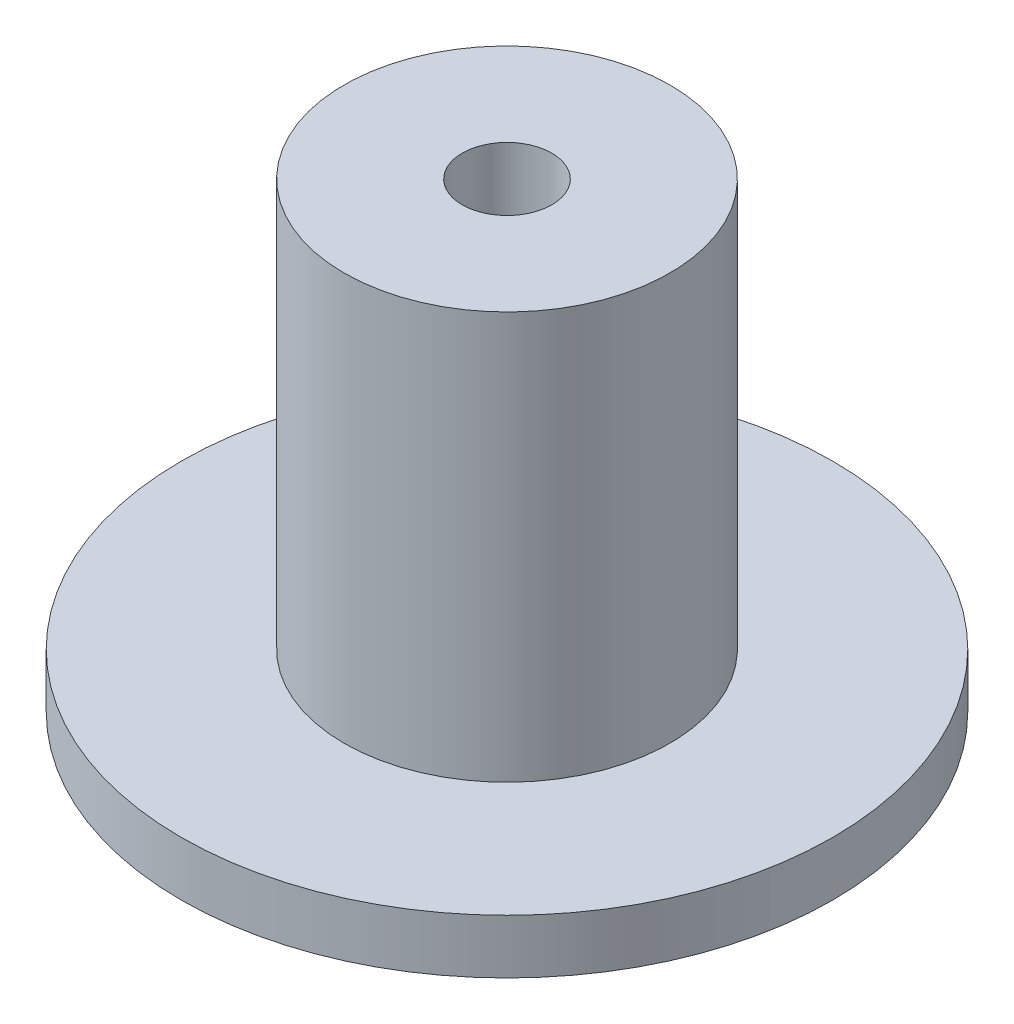
ISO-10303-21;
HEADER;
FILE_DESCRIPTION(('STEP AP214'),'2;1');
FILE_NAME('part.step','',(''),(''),'','','');
FILE_SCHEMA(('AUTOMOTIVE_DESIGN { 1 0 10303 214 1 1 1 1 }'));
ENDSEC;
DATA;
#1=APPLICATION_CONTEXT('core data for automotive mechanical design processes');
#2=APPLICATION_PROTOCOL_DEFINITION('international standard','automotive_design',2000,#1);
#3=PRODUCT_CONTEXT('',#1,'mechanical');
#4=PRODUCT('Part','Part','',(#3));
#5=PRODUCT_RELATED_PRODUCT_CATEGORY('part','',(#4));
#6=PRODUCT_DEFINITION_FORMATION('','',#4);
#7=PRODUCT_DEFINITION_CONTEXT('part definition',#1,'design');
#8=PRODUCT_DEFINITION('design','',#6,#7);
#9=PRODUCT_DEFINITION_SHAPE('','',#8);
#10=(LENGTH_UNIT() NAMED_UNIT(*) SI_UNIT(.MILLI.,.METRE.));
#11=(NAMED_UNIT(*) PLANE_ANGLE_UNIT() SI_UNIT($,.RADIAN.));
#12=(NAMED_UNIT(*) SI_UNIT($,.STERADIAN.) SOLID_ANGLE_UNIT());
#13=UNCERTAINTY_MEASURE_WITH_UNIT(LENGTH_MEASURE(1.E-05),#10,'distance_accuracy_value','');
#14=(GEOMETRIC_REPRESENTATION_CONTEXT(3) GLOBAL_UNCERTAINTY_ASSIGNED_CONTEXT((#13)) GLOBAL_UNIT_ASSIGNED_CONTEXT((#10,
#11,#12)) REPRESENTATION_CONTEXT('',''));
#15=CARTESIAN_POINT('',(0.,0.,0.));
#16=DIRECTION('',(0.,0.,1.));
#17=DIRECTION('',(1.,0.,0.));
#18=AXIS2_PLACEMENT_3D('',#15,#16,#17);
#19=CARTESIAN_POINT('',(0.,0.,0.));
#20=DIRECTION('',(0.,1.,0.));
#21=DIRECTION('',(0.,0.,1.));
#22=AXIS2_PLACEMENT_3D('',#19,#20,#21);
#23=PLANE('',#22);
#24=CARTESIAN_POINT('',(0.,0.,0.));
#25=DIRECTION('',(0.,-1.,0.));
#26=DIRECTION('',(0.,0.,-1.));
#27=AXIS2_PLACEMENT_3D('',#24,#25,#26);
#28=CIRCLE('',#27,2.);
#29=CARTESIAN_POINT('',(0.,0.,-2.));
#30=VERTEX_POINT('',#29);
#31=EDGE_CURVE('E11',#30,#30,#28,.T.);
#32=ORIENTED_EDGE('',*,*,#31,.T.);
#33=EDGE_LOOP('',(#32));
#34=FACE_BOUND('',#33,.T.);
#35=ADVANCED_FACE('F44',(#34),#23,.F.);
#36=CARTESIAN_POINT('',(0.,26.,0.));
#37=DIRECTION('',(0.,-1.,0.));
#38=DIRECTION('',(0.,0.,-1.));
#39=AXIS2_PLACEMENT_3D('',#36,#37,#38);
#40=DEGENERATE_TOROIDAL_SURFACE('',#39,2.00000000000001,26.,.T.);
#41=ORIENTED_EDGE('',*,*,#31,.F.);
#42=EDGE_LOOP('',(#41));
#43=FACE_BOUND('',#42,.T.);
#44=CARTESIAN_POINT('',(0.,2.,0.));
#45=DIRECTION('',(0.,-1.,0.));
#46=DIRECTION('',(0.,0.,-1.));
#47=AXIS2_PLACEMENT_3D('',#44,#45,#46);
#48=CIRCLE('',#47,12.);
#49=CARTESIAN_POINT('',(0.,2.,-12.));
#50=VERTEX_POINT('',#49);
#51=EDGE_CURVE('E51',#50,#50,#48,.T.);
#52=ORIENTED_EDGE('',*,*,#51,.T.);
#53=EDGE_LOOP('',(#52));
#54=FACE_BOUND('',#53,.T.);
#55=ADVANCED_FACE('F86',(#43,#54),#40,.T.);
#56=CARTESIAN_POINT('',(0.,-1.78542622895531,0.));
#57=DIRECTION('',(0.,-1.,0.));
#58=DIRECTION('',(0.,0.,-1.));
#59=AXIS2_PLACEMENT_3D('',#56,#57,#58);
#60=CYLINDRICAL_SURFACE('',#59,12.);
#61=ORIENTED_EDGE('',*,*,#51,.F.);
#62=EDGE_LOOP('',(#61));
#63=FACE_BOUND('',#62,.T.);
#64=CARTESIAN_POINT('',(0.,4.,0.));
#65=DIRECTION('',(0.,-1.,0.));
#66=DIRECTION('',(0.,0.,-1.));
#67=AXIS2_PLACEMENT_3D('',#64,#65,#66);
#68=CIRCLE('',#67,12.);
#69=CARTESIAN_POINT('',(0.,4.,-12.));
#70=VERTEX_POINT('',#69);
#71=EDGE_CURVE('E79',#70,#70,#68,.T.);
#72=ORIENTED_EDGE('',*,*,#71,.T.);
#73=EDGE_LOOP('',(#72));
#74=FACE_BOUND('',#73,.T.);
#75=ADVANCED_FACE('F88',(#63,#74),#60,.T.);
#76=CARTESIAN_POINT('',(-12.,4.,0.));
#77=DIRECTION('',(0.,-1.,0.));
#78=DIRECTION('',(0.,0.,-1.));
#79=AXIS2_PLACEMENT_3D('',#76,#77,#78);
#80=PLANE('',#79);
#81=ORIENTED_EDGE('',*,*,#71,.F.);
#82=EDGE_LOOP('',(#81));
#83=FACE_BOUND('',#82,.T.);
#84=CARTESIAN_POINT('',(0.,4.,0.));
#85=DIRECTION('',(0.,-1.,0.));
#86=DIRECTION('',(0.,0.,-1.));
#87=AXIS2_PLACEMENT_3D('',#84,#85,#86);
#88=CIRCLE('',#87,6.);
#89=CARTESIAN_POINT('',(0.,4.,-6.));
#90=VERTEX_POINT('',#89);
#91=EDGE_CURVE('E71',#90,#90,#88,.T.);
#92=ORIENTED_EDGE('',*,*,#91,.T.);
#93=EDGE_LOOP('',(#92));
#94=FACE_BOUND('',#93,.T.);
#95=ADVANCED_FACE('F91',(#83,#94),#80,.F.);
#96=CARTESIAN_POINT('',(0.,-1.78542622895531,0.));
#97=DIRECTION('',(0.,-1.,0.));
#98=DIRECTION('',(0.,0.,-1.));
#99=AXIS2_PLACEMENT_3D('',#96,#97,#98);
#100=CYLINDRICAL_SURFACE('',#99,6.);
#101=ORIENTED_EDGE('',*,*,#91,.F.);
#102=EDGE_LOOP('',(#101));
#103=FACE_BOUND('',#102,.T.);
#104=CARTESIAN_POINT('',(0.,19.,0.));
#105=DIRECTION('',(0.,-1.,0.));
#106=DIRECTION('',(0.,0.,-1.));
#107=AXIS2_PLACEMENT_3D('',#104,#105,#106);
#108=CIRCLE('',#107,6.);
#109=CARTESIAN_POINT('',(0.,19.,-6.));
#110=VERTEX_POINT('',#109);
#111=EDGE_CURVE('E65',#110,#110,#108,.T.);
#112=ORIENTED_EDGE('',*,*,#111,.T.);
#113=EDGE_LOOP('',(#112));
#114=FACE_BOUND('',#113,.T.);
#115=ADVANCED_FACE('F97',(#103,#114),#100,.T.);
#116=CARTESIAN_POINT('',(-6.,19.,0.));
#117=DIRECTION('',(0.,-1.,0.));
#118=DIRECTION('',(0.,0.,-1.));
#119=AXIS2_PLACEMENT_3D('',#116,#117,#118);
#120=PLANE('',#119);
#121=CARTESIAN_POINT('',(0.,19.,0.));
#122=DIRECTION('',(0.,1.,0.));
#123=DIRECTION('',(0.,0.,1.));
#124=AXIS2_PLACEMENT_3D('',#121,#122,#123);
#125=CIRCLE('',#124,1.65);
#126=CARTESIAN_POINT('',(0.,19.,1.65));
#127=VERTEX_POINT('',#126);
#128=EDGE_CURVE('E66',#127,#127,#125,.T.);
#129=ORIENTED_EDGE('',*,*,#128,.F.);
#130=EDGE_LOOP('',(#129));
#131=FACE_BOUND('',#130,.T.);
#132=ORIENTED_EDGE('',*,*,#111,.F.);
#133=EDGE_LOOP('',(#132));
#134=FACE_BOUND('',#133,.T.);
#135=ADVANCED_FACE('F58',(#131,#134),#120,.F.);
#136=CARTESIAN_POINT('',(0.,8.9,0.));
#137=DIRECTION('',(0.,1.,0.));
#138=DIRECTION('',(0.,0.,1.));
#139=AXIS2_PLACEMENT_3D('',#136,#137,#138);
#140=CONICAL_SURFACE('',#139,1.65,1.02974425867665);
#141=CARTESIAN_POINT('',(0.,7.90857997860452,0.));
#142=VERTEX_POINT('',#141);
#143=VERTEX_LOOP('',#142);
#144=FACE_BOUND('',#143,.T.);
#145=CARTESIAN_POINT('',(0.,8.9,0.));
#146=DIRECTION('',(0.,1.,0.));
#147=DIRECTION('',(0.,0.,1.));
#148=AXIS2_PLACEMENT_3D('',#145,#146,#147);
#149=CIRCLE('',#148,1.65);
#150=CARTESIAN_POINT('',(0.,8.9,1.65));
#151=VERTEX_POINT('',#150);
#152=EDGE_CURVE('E62',#151,#151,#149,.T.);
#153=ORIENTED_EDGE('',*,*,#152,.T.);
#154=EDGE_LOOP('',(#153));
#155=FACE_BOUND('',#154,.T.);
#156=ADVANCED_FACE('F54',(#144,#155),#140,.F.);
#157=CARTESIAN_POINT('',(0.,19.,0.));
#158=DIRECTION('',(0.,1.,0.));
#159=DIRECTION('',(0.,0.,1.));
#160=AXIS2_PLACEMENT_3D('',#157,#158,#159);
#161=CYLINDRICAL_SURFACE('',#160,1.65);
#162=ORIENTED_EDGE('',*,*,#152,.F.);
#163=EDGE_LOOP('',(#162));
#164=FACE_BOUND('',#163,.T.);
#165=ORIENTED_EDGE('',*,*,#128,.T.);
#166=EDGE_LOOP('',(#165));
#167=FACE_BOUND('',#166,.T.);
#168=ADVANCED_FACE('F57',(#164,#167),#161,.F.);
#169=CLOSED_SHELL('',(#35,#55,#75,#95,#115,#135,#156,#168));
#170=MANIFOLD_SOLID_BREP('B2',#169);
#171=ADVANCED_BREP_SHAPE_REPRESENTATION('',(#18,#170),#14);
#172=SHAPE_DEFINITION_REPRESENTATION(#9,#171);
ENDSEC;
END-ISO-10303-21;
